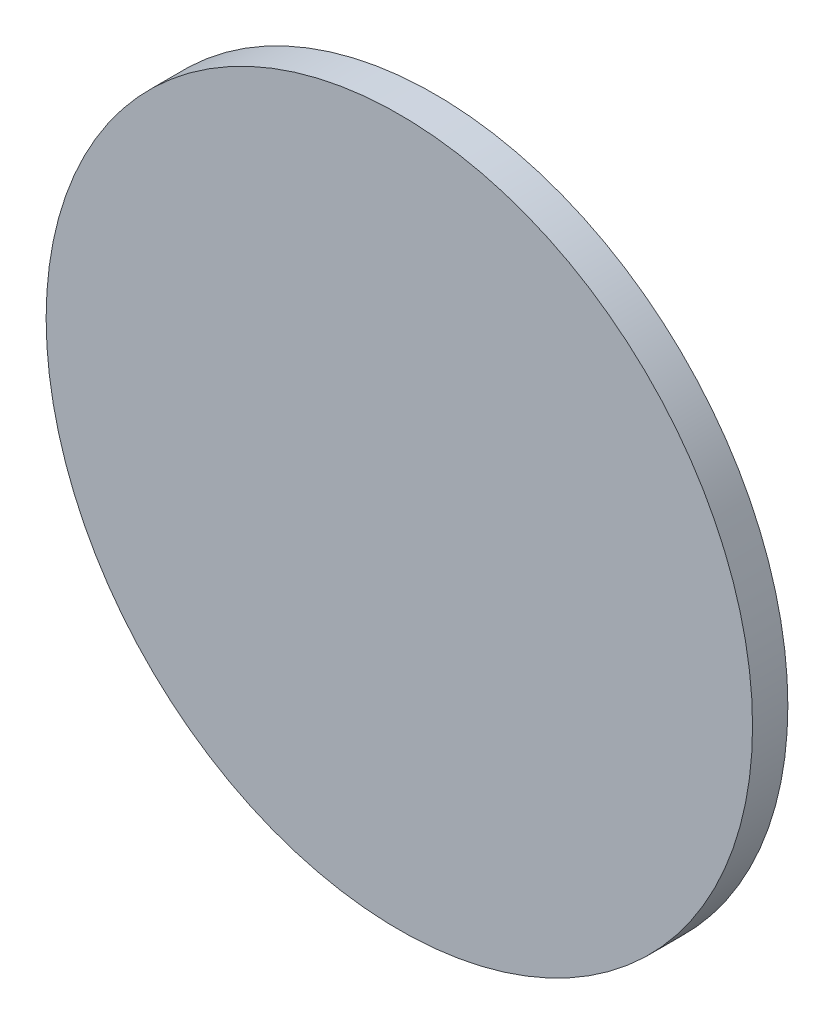
ISO-10303-21;
HEADER;
FILE_DESCRIPTION(('STEP AP214'),'2;1');
FILE_NAME('part.step','',(''),(''),'','','');
FILE_SCHEMA(('AUTOMOTIVE_DESIGN { 1 0 10303 214 1 1 1 1 }'));
ENDSEC;
DATA;
#1=APPLICATION_CONTEXT('core data for automotive mechanical design processes');
#2=APPLICATION_PROTOCOL_DEFINITION('international standard','automotive_design',2000,#1);
#3=PRODUCT_CONTEXT('',#1,'mechanical');
#4=PRODUCT('Part','Part','',(#3));
#5=PRODUCT_RELATED_PRODUCT_CATEGORY('part','',(#4));
#6=PRODUCT_DEFINITION_FORMATION('','',#4);
#7=PRODUCT_DEFINITION_CONTEXT('part definition',#1,'design');
#8=PRODUCT_DEFINITION('design','',#6,#7);
#9=PRODUCT_DEFINITION_SHAPE('','',#8);
#10=(LENGTH_UNIT() NAMED_UNIT(*) SI_UNIT(.MILLI.,.METRE.));
#11=(NAMED_UNIT(*) PLANE_ANGLE_UNIT() SI_UNIT($,.RADIAN.));
#12=(NAMED_UNIT(*) SI_UNIT($,.STERADIAN.) SOLID_ANGLE_UNIT());
#13=UNCERTAINTY_MEASURE_WITH_UNIT(LENGTH_MEASURE(1.E-05),#10,'distance_accuracy_value','');
#14=(GEOMETRIC_REPRESENTATION_CONTEXT(3) GLOBAL_UNCERTAINTY_ASSIGNED_CONTEXT((#13)) GLOBAL_UNIT_ASSIGNED_CONTEXT((#10,
#11,#12)) REPRESENTATION_CONTEXT('',''));
#15=CARTESIAN_POINT('',(0.,0.,0.));
#16=DIRECTION('',(0.,0.,1.));
#17=DIRECTION('',(1.,0.,0.));
#18=AXIS2_PLACEMENT_3D('',#15,#16,#17);
#19=CARTESIAN_POINT('',(-34.5033459985728,21.8341486397219,0.));
#20=DIRECTION('',(0.,0.,1.));
#21=DIRECTION('',(1.,0.,0.));
#22=AXIS2_PLACEMENT_3D('',#19,#20,#21);
#23=PLANE('',#22);
#24=CARTESIAN_POINT('',(-34.5033459985728,21.8341486397219,0.));
#25=DIRECTION('',(0.,0.,-1.));
#26=DIRECTION('',(-1.,0.,0.));
#27=AXIS2_PLACEMENT_3D('',#24,#25,#26);
#28=CIRCLE('',#27,0.5);
#29=CARTESIAN_POINT('',(-35.0033459985728,21.8341486397219,0.));
#30=VERTEX_POINT('',#29);
#31=EDGE_CURVE('E17',#30,#30,#28,.F.);
#32=ORIENTED_EDGE('',*,*,#31,.F.);
#33=EDGE_LOOP('',(#32));
#34=FACE_BOUND('',#33,.T.);
#35=ADVANCED_FACE('F14',(#34),#23,.F.);
#36=CARTESIAN_POINT('',(-34.5033459985728,21.8341486397219,0.05));
#37=DIRECTION('',(0.,0.,-1.));
#38=DIRECTION('',(-1.,0.,0.));
#39=AXIS2_PLACEMENT_3D('',#36,#37,#38);
#40=CYLINDRICAL_SURFACE('',#39,0.5);
#41=ORIENTED_EDGE('',*,*,#31,.T.);
#42=EDGE_LOOP('',(#41));
#43=FACE_BOUND('',#42,.T.);
#44=CARTESIAN_POINT('',(-34.5033459985728,21.8341486397219,0.05));
#45=DIRECTION('',(0.,0.,-1.));
#46=DIRECTION('',(-1.,0.,0.));
#47=AXIS2_PLACEMENT_3D('',#44,#45,#46);
#48=CIRCLE('',#47,0.5);
#49=CARTESIAN_POINT('',(-35.0033459985728,21.8341486397219,0.05));
#50=VERTEX_POINT('',#49);
#51=EDGE_CURVE('E10',#50,#50,#48,.F.);
#52=ORIENTED_EDGE('',*,*,#51,.F.);
#53=EDGE_LOOP('',(#52));
#54=FACE_BOUND('',#53,.T.);
#55=ADVANCED_FACE('F26',(#43,#54),#40,.T.);
#56=CARTESIAN_POINT('',(-34.5033459985728,21.8341486397219,0.05));
#57=DIRECTION('',(0.,0.,1.));
#58=DIRECTION('',(1.,0.,0.));
#59=AXIS2_PLACEMENT_3D('',#56,#57,#58);
#60=PLANE('',#59);
#61=ORIENTED_EDGE('',*,*,#51,.T.);
#62=EDGE_LOOP('',(#61));
#63=FACE_BOUND('',#62,.T.);
#64=ADVANCED_FACE('F34',(#63),#60,.T.);
#65=CLOSED_SHELL('',(#35,#55,#64));
#66=MANIFOLD_SOLID_BREP('B1',#65);
#67=ADVANCED_BREP_SHAPE_REPRESENTATION('',(#18,#66),#14);
#68=SHAPE_DEFINITION_REPRESENTATION(#9,#67);
ENDSEC;
END-ISO-10303-21;
